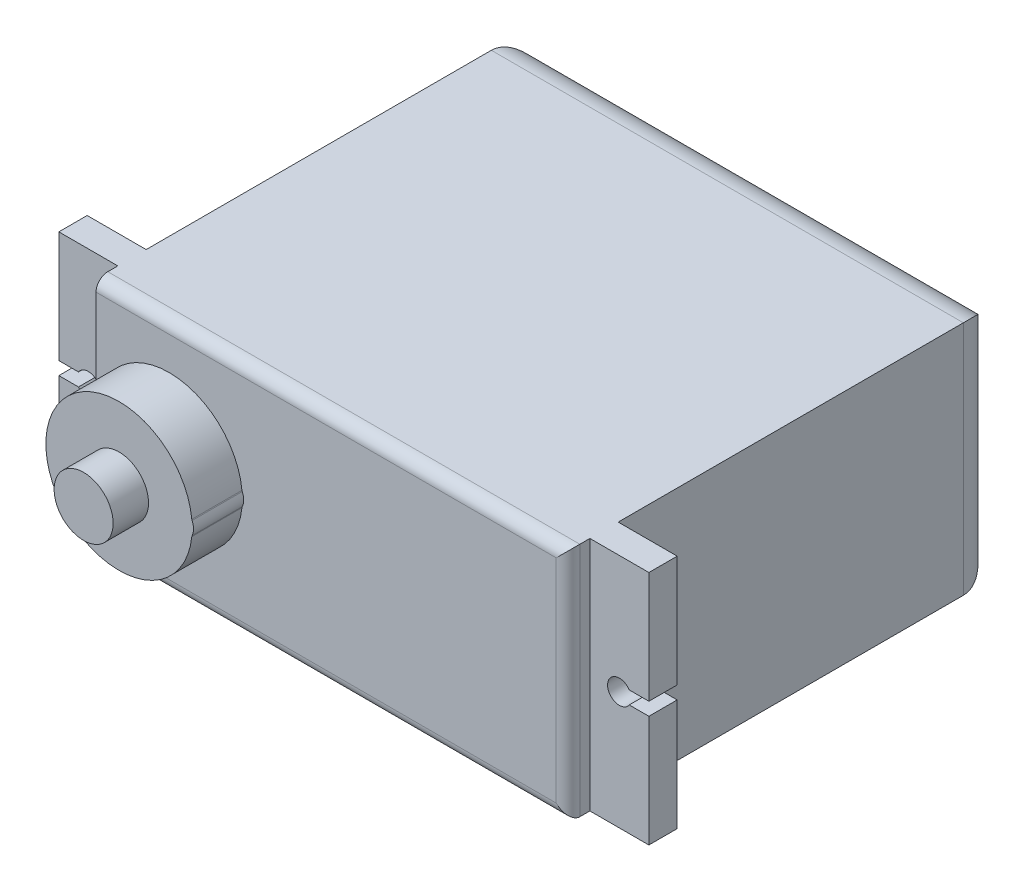
ISO-10303-21;
HEADER;
FILE_DESCRIPTION(('STEP AP214'),'2;1');
FILE_NAME('part.step','',(''),(''),'','','');
FILE_SCHEMA(('AUTOMOTIVE_DESIGN { 1 0 10303 214 1 1 1 1 }'));
ENDSEC;
DATA;
#1=APPLICATION_CONTEXT('core data for automotive mechanical design processes');
#2=APPLICATION_PROTOCOL_DEFINITION('international standard','automotive_design',2000,#1);
#3=PRODUCT_CONTEXT('',#1,'mechanical');
#4=PRODUCT('Part','Part','',(#3));
#5=PRODUCT_RELATED_PRODUCT_CATEGORY('part','',(#4));
#6=PRODUCT_DEFINITION_FORMATION('','',#4);
#7=PRODUCT_DEFINITION_CONTEXT('part definition',#1,'design');
#8=PRODUCT_DEFINITION('design','',#6,#7);
#9=PRODUCT_DEFINITION_SHAPE('','',#8);
#10=(LENGTH_UNIT() NAMED_UNIT(*) SI_UNIT(.MILLI.,.METRE.));
#11=(NAMED_UNIT(*) PLANE_ANGLE_UNIT() SI_UNIT($,.RADIAN.));
#12=(NAMED_UNIT(*) SI_UNIT($,.STERADIAN.) SOLID_ANGLE_UNIT());
#13=UNCERTAINTY_MEASURE_WITH_UNIT(LENGTH_MEASURE(1.E-05),#10,'distance_accuracy_value','');
#14=(GEOMETRIC_REPRESENTATION_CONTEXT(3) GLOBAL_UNCERTAINTY_ASSIGNED_CONTEXT((#13)) GLOBAL_UNIT_ASSIGNED_CONTEXT((#10,
#11,#12)) REPRESENTATION_CONTEXT('',''));
#15=CARTESIAN_POINT('',(0.,0.,0.));
#16=DIRECTION('',(0.,0.,1.));
#17=DIRECTION('',(1.,0.,0.));
#18=AXIS2_PLACEMENT_3D('',#15,#16,#17);
#19=CARTESIAN_POINT('',(25.,15.5461698495448,32.25));
#20=DIRECTION('',(1.,0.,0.));
#21=DIRECTION('',(0.,0.,-1.));
#22=AXIS2_PLACEMENT_3D('',#19,#20,#21);
#23=PLANE('',#22);
#24=DIRECTION('',(0.,0.,1.));
#25=VECTOR('',#24,1.);
#26=CARTESIAN_POINT('',(25.,-0.549999999999994,0.));
#27=LINE('',#26,#25);
#28=CARTESIAN_POINT('',(25.,-0.549999999999994,32.25));
#29=VERTEX_POINT('',#28);
#30=CARTESIAN_POINT('',(25.,-0.549999999999994,34.65));
#31=VERTEX_POINT('',#30);
#32=EDGE_CURVE('E267',#29,#31,#27,.T.);
#33=ORIENTED_EDGE('',*,*,#32,.T.);
#34=DIRECTION('',(0.,-1.,0.));
#35=VECTOR('',#34,1.);
#36=CARTESIAN_POINT('',(25.,15.5461698495448,34.65));
#37=LINE('',#36,#35);
#38=CARTESIAN_POINT('',(25.,-10.,34.65));
#39=VERTEX_POINT('',#38);
#40=EDGE_CURVE('E344',#31,#39,#37,.T.);
#41=ORIENTED_EDGE('',*,*,#40,.T.);
#42=DIRECTION('',(0.,0.,1.));
#43=VECTOR('',#42,1.);
#44=CARTESIAN_POINT('',(25.,-10.,32.25));
#45=LINE('',#44,#43);
#46=CARTESIAN_POINT('',(25.,-10.,32.25));
#47=VERTEX_POINT('',#46);
#48=EDGE_CURVE('E332',#47,#39,#45,.T.);
#49=ORIENTED_EDGE('',*,*,#48,.F.);
#50=DIRECTION('',(0.,-1.,0.));
#51=VECTOR('',#50,1.);
#52=CARTESIAN_POINT('',(25.,15.5461698495448,32.25));
#53=LINE('',#52,#51);
#54=EDGE_CURVE('E348',#29,#47,#53,.T.);
#55=ORIENTED_EDGE('',*,*,#54,.F.);
#56=EDGE_LOOP('',(#33,#41,#49,#55));
#57=FACE_BOUND('',#56,.T.);
#58=ADVANCED_FACE('F34',(#57),#23,.T.);
#59=CARTESIAN_POINT('',(-25.,15.5461698495448,32.25));
#60=DIRECTION('',(-1.,0.,0.));
#61=DIRECTION('',(0.,0.,1.));
#62=AXIS2_PLACEMENT_3D('',#59,#60,#61);
#63=PLANE('',#62);
#64=DIRECTION('',(0.,0.,1.));
#65=VECTOR('',#64,1.);
#66=CARTESIAN_POINT('',(-25.,0.55,0.));
#67=LINE('',#66,#65);
#68=CARTESIAN_POINT('',(-25.,0.55,32.25));
#69=VERTEX_POINT('',#68);
#70=CARTESIAN_POINT('',(-25.,0.55,34.65));
#71=VERTEX_POINT('',#70);
#72=EDGE_CURVE('E261',#69,#71,#67,.T.);
#73=ORIENTED_EDGE('',*,*,#72,.T.);
#74=DIRECTION('',(0.,-1.,0.));
#75=VECTOR('',#74,1.);
#76=CARTESIAN_POINT('',(-25.,15.5461698495448,34.65));
#77=LINE('',#76,#75);
#78=CARTESIAN_POINT('',(-25.,10.,34.65));
#79=VERTEX_POINT('',#78);
#80=EDGE_CURVE('E315',#79,#71,#77,.T.);
#81=ORIENTED_EDGE('',*,*,#80,.F.);
#82=DIRECTION('',(0.,0.,1.));
#83=VECTOR('',#82,1.);
#84=CARTESIAN_POINT('',(-25.,10.,32.25));
#85=LINE('',#84,#83);
#86=CARTESIAN_POINT('',(-25.,10.,32.25));
#87=VERTEX_POINT('',#86);
#88=EDGE_CURVE('E294',#87,#79,#85,.T.);
#89=ORIENTED_EDGE('',*,*,#88,.F.);
#90=DIRECTION('',(0.,-1.,0.));
#91=VECTOR('',#90,1.);
#92=CARTESIAN_POINT('',(-25.,15.5461698495448,32.25));
#93=LINE('',#92,#91);
#94=EDGE_CURVE('E311',#87,#69,#93,.T.);
#95=ORIENTED_EDGE('',*,*,#94,.T.);
#96=EDGE_LOOP('',(#73,#81,#89,#95));
#97=FACE_BOUND('',#96,.T.);
#98=ADVANCED_FACE('F471',(#97),#63,.T.);
#99=CARTESIAN_POINT('',(-20.,-10.,36.5));
#100=DIRECTION('',(1.,0.,0.));
#101=DIRECTION('',(0.,0.,-1.));
#102=AXIS2_PLACEMENT_3D('',#99,#100,#101);
#103=PLANE('',#102);
#104=DIRECTION('',(0.,0.,-1.));
#105=VECTOR('',#104,1.);
#106=CARTESIAN_POINT('',(-20.,10.,36.5));
#107=LINE('',#106,#105);
#108=CARTESIAN_POINT('',(-20.,10.,32.25));
#109=VERTEX_POINT('',#108);
#110=CARTESIAN_POINT('',(-20.,10.,3.));
#111=VERTEX_POINT('',#110);
#112=EDGE_CURVE('E361',#109,#111,#107,.T.);
#113=ORIENTED_EDGE('',*,*,#112,.T.);
#114=DIRECTION('',(0.,-1.,0.));
#115=VECTOR('',#114,1.);
#116=CARTESIAN_POINT('',(-20.,-10.,3.));
#117=LINE('',#116,#115);
#118=CARTESIAN_POINT('',(-20.,-10.,3.));
#119=VERTEX_POINT('',#118);
#120=EDGE_CURVE('E390',#111,#119,#117,.T.);
#121=ORIENTED_EDGE('',*,*,#120,.T.);
#122=DIRECTION('',(0.,0.,-1.));
#123=VECTOR('',#122,1.);
#124=CARTESIAN_POINT('',(-20.,-10.,36.5));
#125=LINE('',#124,#123);
#126=CARTESIAN_POINT('',(-20.,-10.,32.25));
#127=VERTEX_POINT('',#126);
#128=EDGE_CURVE('E358',#127,#119,#125,.T.);
#129=ORIENTED_EDGE('',*,*,#128,.F.);
#130=DIRECTION('',(0.,-1.,0.));
#131=VECTOR('',#130,1.);
#132=CARTESIAN_POINT('',(-20.,15.5461698495448,32.25));
#133=LINE('',#132,#131);
#134=EDGE_CURVE('E297',#109,#127,#133,.T.);
#135=ORIENTED_EDGE('',*,*,#134,.F.);
#136=EDGE_LOOP('',(#113,#121,#129,#135));
#137=FACE_BOUND('',#136,.T.);
#138=ADVANCED_FACE('F478',(#137),#103,.F.);
#139=CARTESIAN_POINT('',(20.,-10.,36.5));
#140=DIRECTION('',(-1.,0.,0.));
#141=DIRECTION('',(0.,0.,1.));
#142=AXIS2_PLACEMENT_3D('',#139,#140,#141);
#143=PLANE('',#142);
#144=DIRECTION('',(0.,0.,-1.));
#145=VECTOR('',#144,1.);
#146=CARTESIAN_POINT('',(20.,10.,36.5));
#147=LINE('',#146,#145);
#148=CARTESIAN_POINT('',(20.,10.,35.5));
#149=VERTEX_POINT('',#148);
#150=CARTESIAN_POINT('',(20.,10.,34.65));
#151=VERTEX_POINT('',#150);
#152=EDGE_CURVE('E365',#149,#151,#147,.T.);
#153=ORIENTED_EDGE('',*,*,#152,.F.);
#154=DIRECTION('',(0.,1.,0.));
#155=VECTOR('',#154,1.);
#156=CARTESIAN_POINT('',(20.,-10.,35.5));
#157=LINE('',#156,#155);
#158=CARTESIAN_POINT('',(20.,-10.,35.5));
#159=VERTEX_POINT('',#158);
#160=EDGE_CURVE('E43',#149,#159,#157,.F.);
#161=ORIENTED_EDGE('',*,*,#160,.T.);
#162=DIRECTION('',(0.,0.,-1.));
#163=VECTOR('',#162,1.);
#164=CARTESIAN_POINT('',(20.,-10.,36.5));
#165=LINE('',#164,#163);
#166=CARTESIAN_POINT('',(20.,-10.,34.65));
#167=VERTEX_POINT('',#166);
#168=EDGE_CURVE('E356',#159,#167,#165,.T.);
#169=ORIENTED_EDGE('',*,*,#168,.T.);
#170=DIRECTION('',(0.,-1.,0.));
#171=VECTOR('',#170,1.);
#172=CARTESIAN_POINT('',(20.,15.5461698495448,34.65));
#173=LINE('',#172,#171);
#174=EDGE_CURVE('E327',#151,#167,#173,.T.);
#175=ORIENTED_EDGE('',*,*,#174,.F.);
#176=EDGE_LOOP('',(#153,#161,#169,#175));
#177=FACE_BOUND('',#176,.T.);
#178=ADVANCED_FACE('F570',(#177),#143,.F.);
#179=CARTESIAN_POINT('',(20.,-10.,32.25));
#180=VERTEX_POINT('',#179);
#181=CARTESIAN_POINT('',(20.,-10.,3.));
#182=VERTEX_POINT('',#181);
#183=EDGE_CURVE('E355',#180,#182,#165,.T.);
#184=ORIENTED_EDGE('',*,*,#183,.T.);
#185=DIRECTION('',(0.,1.,0.));
#186=VECTOR('',#185,1.);
#187=CARTESIAN_POINT('',(20.,10.,3.));
#188=LINE('',#187,#186);
#189=CARTESIAN_POINT('',(20.,10.,3.));
#190=VERTEX_POINT('',#189);
#191=EDGE_CURVE('E375',#182,#190,#188,.T.);
#192=ORIENTED_EDGE('',*,*,#191,.T.);
#193=CARTESIAN_POINT('',(20.,10.,32.25));
#194=VERTEX_POINT('',#193);
#195=EDGE_CURVE('E364',#194,#190,#147,.T.);
#196=ORIENTED_EDGE('',*,*,#195,.F.);
#197=DIRECTION('',(0.,-1.,0.));
#198=VECTOR('',#197,1.);
#199=CARTESIAN_POINT('',(20.,15.5461698495448,32.25));
#200=LINE('',#199,#198);
#201=EDGE_CURVE('E338',#194,#180,#200,.T.);
#202=ORIENTED_EDGE('',*,*,#201,.T.);
#203=EDGE_LOOP('',(#184,#192,#196,#202));
#204=FACE_BOUND('',#203,.T.);
#205=ADVANCED_FACE('F531',(#204),#143,.F.);
#206=CARTESIAN_POINT('',(-20.,10.,36.5));
#207=DIRECTION('',(0.,-1.,0.));
#208=DIRECTION('',(0.,0.,-1.));
#209=AXIS2_PLACEMENT_3D('',#206,#207,#208);
#210=PLANE('',#209);
#211=CARTESIAN_POINT('',(-20.,10.,35.5));
#212=VERTEX_POINT('',#211);
#213=CARTESIAN_POINT('',(-20.,10.,34.65));
#214=VERTEX_POINT('',#213);
#215=EDGE_CURVE('E362',#212,#214,#107,.T.);
#216=ORIENTED_EDGE('',*,*,#215,.F.);
#217=DIRECTION('',(-1.,0.,0.));
#218=VECTOR('',#217,1.);
#219=CARTESIAN_POINT('',(-20.,10.,35.5));
#220=LINE('',#219,#218);
#221=EDGE_CURVE('E11',#212,#149,#220,.F.);
#222=ORIENTED_EDGE('',*,*,#221,.T.);
#223=ORIENTED_EDGE('',*,*,#152,.T.);
#224=DIRECTION('',(1.,0.,0.));
#225=VECTOR('',#224,1.);
#226=CARTESIAN_POINT('',(20.,10.,34.65));
#227=LINE('',#226,#225);
#228=CARTESIAN_POINT('',(25.,10.,34.65));
#229=VERTEX_POINT('',#228);
#230=EDGE_CURVE('E326',#151,#229,#227,.T.);
#231=ORIENTED_EDGE('',*,*,#230,.T.);
#232=DIRECTION('',(0.,0.,-1.));
#233=VECTOR('',#232,1.);
#234=CARTESIAN_POINT('',(25.,10.,32.25));
#235=LINE('',#234,#233);
#236=CARTESIAN_POINT('',(25.,10.,32.25));
#237=VERTEX_POINT('',#236);
#238=EDGE_CURVE('E324',#229,#237,#235,.T.);
#239=ORIENTED_EDGE('',*,*,#238,.T.);
#240=DIRECTION('',(-1.,0.,0.));
#241=VECTOR('',#240,1.);
#242=CARTESIAN_POINT('',(20.,10.,32.25));
#243=LINE('',#242,#241);
#244=EDGE_CURVE('E329',#237,#194,#243,.T.);
#245=ORIENTED_EDGE('',*,*,#244,.T.);
#246=ORIENTED_EDGE('',*,*,#195,.T.);
#247=DIRECTION('',(-1.,0.,0.));
#248=VECTOR('',#247,1.);
#249=CARTESIAN_POINT('',(-20.,10.,3.));
#250=LINE('',#249,#248);
#251=EDGE_CURVE('E388',#190,#111,#250,.T.);
#252=ORIENTED_EDGE('',*,*,#251,.T.);
#253=ORIENTED_EDGE('',*,*,#112,.F.);
#254=DIRECTION('',(-1.,0.,0.));
#255=VECTOR('',#254,1.);
#256=CARTESIAN_POINT('',(-20.,10.,32.25));
#257=LINE('',#256,#255);
#258=EDGE_CURVE('E296',#109,#87,#257,.T.);
#259=ORIENTED_EDGE('',*,*,#258,.T.);
#260=ORIENTED_EDGE('',*,*,#88,.T.);
#261=DIRECTION('',(1.,0.,0.));
#262=VECTOR('',#261,1.);
#263=CARTESIAN_POINT('',(-20.,10.,34.65));
#264=LINE('',#263,#262);
#265=EDGE_CURVE('E299',#79,#214,#264,.T.);
#266=ORIENTED_EDGE('',*,*,#265,.T.);
#267=EDGE_LOOP('',(#216,#222,#223,#231,#239,#245,#246,#252,#253,#259,#260,#266));
#268=FACE_BOUND('',#267,.T.);
#269=ADVANCED_FACE('F509',(#268),#210,.F.);
#270=CARTESIAN_POINT('',(-20.,-10.,35.5));
#271=VERTEX_POINT('',#270);
#272=CARTESIAN_POINT('',(-20.,-10.,34.65));
#273=VERTEX_POINT('',#272);
#274=EDGE_CURVE('E359',#271,#273,#125,.T.);
#275=ORIENTED_EDGE('',*,*,#274,.F.);
#276=CARTESIAN_POINT('',(-20.,-9.,35.5));
#277=DIRECTION('',(1.,0.,0.));
#278=DIRECTION('',(0.,0.,-1.));
#279=AXIS2_PLACEMENT_3D('',#276,#277,#278);
#280=CIRCLE('',#279,1.);
#281=CARTESIAN_POINT('',(-20.,-9.,36.5));
#282=VERTEX_POINT('',#281);
#283=EDGE_CURVE('E415',#271,#282,#280,.F.);
#284=ORIENTED_EDGE('',*,*,#283,.T.);
#285=DIRECTION('',(0.,-1.,0.));
#286=VECTOR('',#285,1.);
#287=CARTESIAN_POINT('',(-20.,-10.,36.5));
#288=LINE('',#287,#286);
#289=CARTESIAN_POINT('',(-20.,0.,36.5));
#290=VERTEX_POINT('',#289);
#291=EDGE_CURVE('E352',#290,#282,#288,.T.);
#292=ORIENTED_EDGE('',*,*,#291,.F.);
#293=CARTESIAN_POINT('',(-20.,9.,36.5));
#294=VERTEX_POINT('',#293);
#295=EDGE_CURVE('E353',#294,#290,#288,.T.);
#296=ORIENTED_EDGE('',*,*,#295,.F.);
#297=CARTESIAN_POINT('',(-20.,9.,35.5));
#298=DIRECTION('',(1.,0.,0.));
#299=DIRECTION('',(0.,0.,-1.));
#300=AXIS2_PLACEMENT_3D('',#297,#298,#299);
#301=CIRCLE('',#300,1.);
#302=EDGE_CURVE('E57',#294,#212,#301,.F.);
#303=ORIENTED_EDGE('',*,*,#302,.T.);
#304=ORIENTED_EDGE('',*,*,#215,.T.);
#305=DIRECTION('',(0.,-1.,0.));
#306=VECTOR('',#305,1.);
#307=CARTESIAN_POINT('',(-20.,15.5461698495448,34.65));
#308=LINE('',#307,#306);
#309=EDGE_CURVE('E308',#214,#273,#308,.T.);
#310=ORIENTED_EDGE('',*,*,#309,.T.);
#311=EDGE_LOOP('',(#275,#284,#292,#296,#303,#304,#310));
#312=FACE_BOUND('',#311,.T.);
#313=ADVANCED_FACE('F436',(#312),#103,.F.);
#314=CARTESIAN_POINT('',(-20.,-10.,36.5));
#315=DIRECTION('',(0.,1.,0.));
#316=DIRECTION('',(0.,0.,1.));
#317=AXIS2_PLACEMENT_3D('',#314,#315,#316);
#318=PLANE('',#317);
#319=ORIENTED_EDGE('',*,*,#168,.F.);
#320=DIRECTION('',(1.,0.,0.));
#321=VECTOR('',#320,1.);
#322=CARTESIAN_POINT('',(-20.,-10.,35.5));
#323=LINE('',#322,#321);
#324=EDGE_CURVE('E412',#159,#271,#323,.F.);
#325=ORIENTED_EDGE('',*,*,#324,.T.);
#326=ORIENTED_EDGE('',*,*,#274,.T.);
#327=DIRECTION('',(-1.,0.,0.));
#328=VECTOR('',#327,1.);
#329=CARTESIAN_POINT('',(-20.,-10.,34.65));
#330=LINE('',#329,#328);
#331=CARTESIAN_POINT('',(-25.,-10.,34.65));
#332=VERTEX_POINT('',#331);
#333=EDGE_CURVE('E293',#273,#332,#330,.T.);
#334=ORIENTED_EDGE('',*,*,#333,.T.);
#335=DIRECTION('',(0.,0.,-1.));
#336=VECTOR('',#335,1.);
#337=CARTESIAN_POINT('',(-25.,-10.,32.25));
#338=LINE('',#337,#336);
#339=CARTESIAN_POINT('',(-25.,-10.,32.25));
#340=VERTEX_POINT('',#339);
#341=EDGE_CURVE('E302',#332,#340,#338,.T.);
#342=ORIENTED_EDGE('',*,*,#341,.T.);
#343=DIRECTION('',(1.,0.,0.));
#344=VECTOR('',#343,1.);
#345=CARTESIAN_POINT('',(-20.,-10.,32.25));
#346=LINE('',#345,#344);
#347=EDGE_CURVE('E305',#340,#127,#346,.T.);
#348=ORIENTED_EDGE('',*,*,#347,.T.);
#349=ORIENTED_EDGE('',*,*,#128,.T.);
#350=DIRECTION('',(1.,0.,0.));
#351=VECTOR('',#350,1.);
#352=CARTESIAN_POINT('',(20.,-10.,3.));
#353=LINE('',#352,#351);
#354=EDGE_CURVE('E392',#119,#182,#353,.T.);
#355=ORIENTED_EDGE('',*,*,#354,.T.);
#356=ORIENTED_EDGE('',*,*,#183,.F.);
#357=DIRECTION('',(1.,0.,0.));
#358=VECTOR('',#357,1.);
#359=CARTESIAN_POINT('',(20.,-10.,32.25));
#360=LINE('',#359,#358);
#361=EDGE_CURVE('E323',#180,#47,#360,.T.);
#362=ORIENTED_EDGE('',*,*,#361,.T.);
#363=ORIENTED_EDGE('',*,*,#48,.T.);
#364=DIRECTION('',(-1.,0.,0.));
#365=VECTOR('',#364,1.);
#366=CARTESIAN_POINT('',(20.,-10.,34.65));
#367=LINE('',#366,#365);
#368=EDGE_CURVE('E335',#39,#167,#367,.T.);
#369=ORIENTED_EDGE('',*,*,#368,.T.);
#370=EDGE_LOOP('',(#319,#325,#326,#334,#342,#348,#349,#355,#356,#362,#363,#369));
#371=FACE_BOUND('',#370,.T.);
#372=ADVANCED_FACE('F525',(#371),#318,.F.);
#373=CARTESIAN_POINT('',(0.,0.,36.5));
#374=DIRECTION('',(0.,0.,-1.));
#375=DIRECTION('',(-1.,0.,0.));
#376=AXIS2_PLACEMENT_3D('',#373,#374,#375);
#377=PLANE('',#376);
#378=ORIENTED_EDGE('',*,*,#291,.T.);
#379=DIRECTION('',(1.,0.,0.));
#380=VECTOR('',#379,1.);
#381=CARTESIAN_POINT('',(0.,-9.,36.5));
#382=LINE('',#381,#380);
#383=CARTESIAN_POINT('',(19.,-9.,36.5));
#384=VERTEX_POINT('',#383);
#385=EDGE_CURVE('E409',#282,#384,#382,.T.);
#386=ORIENTED_EDGE('',*,*,#385,.T.);
#387=DIRECTION('',(0.,1.,0.));
#388=VECTOR('',#387,1.);
#389=CARTESIAN_POINT('',(19.,0.,36.5));
#390=LINE('',#389,#388);
#391=CARTESIAN_POINT('',(19.,9.,36.5));
#392=VERTEX_POINT('',#391);
#393=EDGE_CURVE('E407',#384,#392,#390,.T.);
#394=ORIENTED_EDGE('',*,*,#393,.T.);
#395=DIRECTION('',(-1.,0.,0.));
#396=VECTOR('',#395,1.);
#397=CARTESIAN_POINT('',(0.,9.,36.5));
#398=LINE('',#397,#396);
#399=EDGE_CURVE('E394',#392,#294,#398,.T.);
#400=ORIENTED_EDGE('',*,*,#399,.T.);
#401=ORIENTED_EDGE('',*,*,#295,.T.);
#402=CARTESIAN_POINT('',(-13.8,0.,36.5));
#403=DIRECTION('',(0.,0.,1.));
#404=DIRECTION('',(1.,0.,0.));
#405=AXIS2_PLACEMENT_3D('',#402,#403,#404);
#406=CIRCLE('',#405,6.2);
#407=CARTESIAN_POINT('',(-7.63295595507192,0.638410328798895,36.5));
#408=VERTEX_POINT('',#407);
#409=EDGE_CURVE('E244',#408,#290,#406,.T.);
#410=ORIENTED_EDGE('',*,*,#409,.F.);
#411=CARTESIAN_POINT('',(-7.38428482422805,0.664152680766592,36.5));
#412=DIRECTION('',(0.,0.,-1.));
#413=DIRECTION('',(-1.,0.,0.));
#414=AXIS2_PLACEMENT_3D('',#411,#412,#413);
#415=CIRCLE('',#414,0.25);
#416=CARTESIAN_POINT('',(-7.61017197666384,0.557031280642949,36.5));
#417=VERTEX_POINT('',#416);
#418=EDGE_CURVE('E445',#417,#408,#415,.T.);
#419=ORIENTED_EDGE('',*,*,#418,.F.);
#420=CARTESIAN_POINT('',(-8.78478516932995,0.,36.5));
#421=DIRECTION('',(0.,0.,1.));
#422=DIRECTION('',(1.,0.,0.));
#423=AXIS2_PLACEMENT_3D('',#420,#421,#422);
#424=CIRCLE('',#423,1.3);
#425=CARTESIAN_POINT('',(-7.61017197666384,-0.557031280642949,36.5));
#426=VERTEX_POINT('',#425);
#427=EDGE_CURVE('E447',#426,#417,#424,.T.);
#428=ORIENTED_EDGE('',*,*,#427,.F.);
#429=CARTESIAN_POINT('',(-7.38428482422805,-0.664152680766593,36.5));
#430=DIRECTION('',(0.,0.,-1.));
#431=DIRECTION('',(1.,0.,0.));
#432=AXIS2_PLACEMENT_3D('',#429,#430,#431);
#433=CIRCLE('',#432,0.25);
#434=CARTESIAN_POINT('',(-7.63295595507192,-0.638410328798899,36.5));
#435=VERTEX_POINT('',#434);
#436=EDGE_CURVE('E247',#435,#426,#433,.T.);
#437=ORIENTED_EDGE('',*,*,#436,.F.);
#438=EDGE_CURVE('E374',#290,#435,#406,.T.);
#439=ORIENTED_EDGE('',*,*,#438,.F.);
#440=EDGE_LOOP('',(#378,#386,#394,#400,#401,#410,#419,#428,#437,#439));
#441=FACE_BOUND('',#440,.T.);
#442=ADVANCED_FACE('F432',(#441),#377,.F.);
#443=CARTESIAN_POINT('',(0.,0.,0.));
#444=DIRECTION('',(0.,0.,-1.));
#445=DIRECTION('',(-1.,0.,0.));
#446=AXIS2_PLACEMENT_3D('',#443,#444,#445);
#447=PLANE('',#446);
#448=DIRECTION('',(-1.,0.,0.));
#449=VECTOR('',#448,1.);
#450=CARTESIAN_POINT('',(20.,7.,0.));
#451=LINE('',#450,#449);
#452=CARTESIAN_POINT('',(-17.,7.,0.));
#453=VERTEX_POINT('',#452);
#454=CARTESIAN_POINT('',(17.,7.,0.));
#455=VERTEX_POINT('',#454);
#456=EDGE_CURVE('E383',#453,#455,#451,.F.);
#457=ORIENTED_EDGE('',*,*,#456,.T.);
#458=DIRECTION('',(0.,1.,0.));
#459=VECTOR('',#458,1.);
#460=CARTESIAN_POINT('',(17.,-10.,0.));
#461=LINE('',#460,#459);
#462=CARTESIAN_POINT('',(17.,-7.,0.));
#463=VERTEX_POINT('',#462);
#464=EDGE_CURVE('E385',#455,#463,#461,.F.);
#465=ORIENTED_EDGE('',*,*,#464,.T.);
#466=DIRECTION('',(1.,0.,0.));
#467=VECTOR('',#466,1.);
#468=CARTESIAN_POINT('',(-20.,-7.,0.));
#469=LINE('',#468,#467);
#470=CARTESIAN_POINT('',(-17.,-7.,0.));
#471=VERTEX_POINT('',#470);
#472=EDGE_CURVE('E378',#463,#471,#469,.F.);
#473=ORIENTED_EDGE('',*,*,#472,.T.);
#474=DIRECTION('',(0.,-1.,0.));
#475=VECTOR('',#474,1.);
#476=CARTESIAN_POINT('',(-17.,10.,0.));
#477=LINE('',#476,#475);
#478=EDGE_CURVE('E381',#471,#453,#477,.F.);
#479=ORIENTED_EDGE('',*,*,#478,.T.);
#480=EDGE_LOOP('',(#457,#465,#473,#479));
#481=FACE_BOUND('',#480,.T.);
#482=ADVANCED_FACE('F494',(#481),#447,.T.);
#483=CARTESIAN_POINT('',(20.,15.5461698495448,34.65));
#484=DIRECTION('',(0.,0.,1.));
#485=DIRECTION('',(1.,0.,0.));
#486=AXIS2_PLACEMENT_3D('',#483,#484,#485);
#487=PLANE('',#486);
#488=DIRECTION('',(1.,0.,0.));
#489=VECTOR('',#488,1.);
#490=CARTESIAN_POINT('',(25.,-0.549999999999994,34.65));
#491=LINE('',#490,#489);
#492=CARTESIAN_POINT('',(23.3351646544245,-0.550000000000006,34.65));
#493=VERTEX_POINT('',#492);
#494=EDGE_CURVE('E264',#493,#31,#491,.T.);
#495=ORIENTED_EDGE('',*,*,#494,.F.);
#496=CARTESIAN_POINT('',(22.5,0.,34.65));
#497=DIRECTION('',(0.,0.,1.));
#498=DIRECTION('',(-1.,0.,0.));
#499=AXIS2_PLACEMENT_3D('',#496,#497,#498);
#500=CIRCLE('',#499,1.);
#501=CARTESIAN_POINT('',(23.3351646544245,0.550000000000008,34.65));
#502=VERTEX_POINT('',#501);
#503=EDGE_CURVE('E260',#502,#493,#500,.T.);
#504=ORIENTED_EDGE('',*,*,#503,.F.);
#505=DIRECTION('',(-1.,0.,0.));
#506=VECTOR('',#505,1.);
#507=CARTESIAN_POINT('',(25.,0.549999999999994,34.65));
#508=LINE('',#507,#506);
#509=CARTESIAN_POINT('',(25.,0.549999999999994,34.65));
#510=VERTEX_POINT('',#509);
#511=EDGE_CURVE('E257',#510,#502,#508,.T.);
#512=ORIENTED_EDGE('',*,*,#511,.F.);
#513=EDGE_CURVE('E341',#229,#510,#37,.T.);
#514=ORIENTED_EDGE('',*,*,#513,.F.);
#515=ORIENTED_EDGE('',*,*,#230,.F.);
#516=ORIENTED_EDGE('',*,*,#174,.T.);
#517=ORIENTED_EDGE('',*,*,#368,.F.);
#518=ORIENTED_EDGE('',*,*,#40,.F.);
#519=EDGE_LOOP('',(#495,#504,#512,#514,#515,#516,#517,#518));
#520=FACE_BOUND('',#519,.T.);
#521=ADVANCED_FACE('F486',(#520),#487,.T.);
#522=DIRECTION('',(0.,0.,1.));
#523=VECTOR('',#522,1.);
#524=CARTESIAN_POINT('',(25.,0.549999999999994,0.));
#525=LINE('',#524,#523);
#526=CARTESIAN_POINT('',(25.,0.549999999999994,32.25));
#527=VERTEX_POINT('',#526);
#528=EDGE_CURVE('E266',#527,#510,#525,.T.);
#529=ORIENTED_EDGE('',*,*,#528,.F.);
#530=EDGE_CURVE('E345',#237,#527,#53,.T.);
#531=ORIENTED_EDGE('',*,*,#530,.F.);
#532=ORIENTED_EDGE('',*,*,#238,.F.);
#533=ORIENTED_EDGE('',*,*,#513,.T.);
#534=EDGE_LOOP('',(#529,#531,#532,#533));
#535=FACE_BOUND('',#534,.T.);
#536=ADVANCED_FACE('F474',(#535),#23,.T.);
#537=CARTESIAN_POINT('',(20.,15.5461698495448,32.25));
#538=DIRECTION('',(0.,0.,-1.));
#539=DIRECTION('',(-1.,0.,0.));
#540=AXIS2_PLACEMENT_3D('',#537,#538,#539);
#541=PLANE('',#540);
#542=DIRECTION('',(-1.,0.,0.));
#543=VECTOR('',#542,1.);
#544=CARTESIAN_POINT('',(20.0000000000001,-0.550000000000028,32.25));
#545=LINE('',#544,#543);
#546=CARTESIAN_POINT('',(23.3351646544245,-0.550000000000006,32.25));
#547=VERTEX_POINT('',#546);
#548=EDGE_CURVE('E372',#29,#547,#545,.T.);
#549=ORIENTED_EDGE('',*,*,#548,.F.);
#550=ORIENTED_EDGE('',*,*,#54,.T.);
#551=ORIENTED_EDGE('',*,*,#361,.F.);
#552=ORIENTED_EDGE('',*,*,#201,.F.);
#553=ORIENTED_EDGE('',*,*,#244,.F.);
#554=ORIENTED_EDGE('',*,*,#530,.T.);
#555=DIRECTION('',(1.,0.,0.));
#556=VECTOR('',#555,1.);
#557=CARTESIAN_POINT('',(19.9999999999999,0.550000000000028,32.25));
#558=LINE('',#557,#556);
#559=CARTESIAN_POINT('',(23.3351646544245,0.550000000000004,32.25));
#560=VERTEX_POINT('',#559);
#561=EDGE_CURVE('E367',#560,#527,#558,.T.);
#562=ORIENTED_EDGE('',*,*,#561,.F.);
#563=CARTESIAN_POINT('',(22.5,0.,32.25));
#564=DIRECTION('',(0.,0.,-1.));
#565=DIRECTION('',(-1.,0.,0.));
#566=AXIS2_PLACEMENT_3D('',#563,#564,#565);
#567=CIRCLE('',#566,1.);
#568=EDGE_CURVE('E369',#547,#560,#567,.T.);
#569=ORIENTED_EDGE('',*,*,#568,.F.);
#570=EDGE_LOOP('',(#549,#550,#551,#552,#553,#554,#562,#569));
#571=FACE_BOUND('',#570,.T.);
#572=ADVANCED_FACE('F485',(#571),#541,.T.);
#573=CARTESIAN_POINT('',(-20.,15.5461698495448,32.25));
#574=DIRECTION('',(0.,0.,-1.));
#575=DIRECTION('',(-1.,0.,0.));
#576=AXIS2_PLACEMENT_3D('',#573,#574,#575);
#577=PLANE('',#576);
#578=DIRECTION('',(1.,0.,0.));
#579=VECTOR('',#578,1.);
#580=CARTESIAN_POINT('',(-20.,0.55,32.25));
#581=LINE('',#580,#579);
#582=CARTESIAN_POINT('',(-23.3351646544245,0.55,32.25));
#583=VERTEX_POINT('',#582);
#584=EDGE_CURVE('E291',#69,#583,#581,.T.);
#585=ORIENTED_EDGE('',*,*,#584,.F.);
#586=ORIENTED_EDGE('',*,*,#94,.F.);
#587=ORIENTED_EDGE('',*,*,#258,.F.);
#588=ORIENTED_EDGE('',*,*,#134,.T.);
#589=ORIENTED_EDGE('',*,*,#347,.F.);
#590=CARTESIAN_POINT('',(-25.,-0.55,32.25));
#591=VERTEX_POINT('',#590);
#592=EDGE_CURVE('E314',#591,#340,#93,.T.);
#593=ORIENTED_EDGE('',*,*,#592,.F.);
#594=DIRECTION('',(-1.,0.,0.));
#595=VECTOR('',#594,1.);
#596=CARTESIAN_POINT('',(-20.,-0.55,32.25));
#597=LINE('',#596,#595);
#598=CARTESIAN_POINT('',(-23.3351646544245,-0.55,32.25));
#599=VERTEX_POINT('',#598);
#600=EDGE_CURVE('E270',#599,#591,#597,.T.);
#601=ORIENTED_EDGE('',*,*,#600,.F.);
#602=CARTESIAN_POINT('',(-22.5,0.,32.25));
#603=DIRECTION('',(0.,0.,-1.));
#604=DIRECTION('',(-1.,0.,0.));
#605=AXIS2_PLACEMENT_3D('',#602,#603,#604);
#606=CIRCLE('',#605,1.);
#607=EDGE_CURVE('E289',#583,#599,#606,.T.);
#608=ORIENTED_EDGE('',*,*,#607,.F.);
#609=EDGE_LOOP('',(#585,#586,#587,#588,#589,#593,#601,#608));
#610=FACE_BOUND('',#609,.T.);
#611=ADVANCED_FACE('F492',(#610),#577,.T.);
#612=DIRECTION('',(0.,0.,1.));
#613=VECTOR('',#612,1.);
#614=CARTESIAN_POINT('',(-25.,-0.55,0.));
#615=LINE('',#614,#613);
#616=CARTESIAN_POINT('',(-25.,-0.55,34.65));
#617=VERTEX_POINT('',#616);
#618=EDGE_CURVE('E280',#591,#617,#615,.T.);
#619=ORIENTED_EDGE('',*,*,#618,.F.);
#620=ORIENTED_EDGE('',*,*,#592,.T.);
#621=ORIENTED_EDGE('',*,*,#341,.F.);
#622=EDGE_CURVE('E318',#617,#332,#77,.T.);
#623=ORIENTED_EDGE('',*,*,#622,.F.);
#624=EDGE_LOOP('',(#619,#620,#621,#623));
#625=FACE_BOUND('',#624,.T.);
#626=ADVANCED_FACE('F481',(#625),#63,.T.);
#627=CARTESIAN_POINT('',(-20.,15.5461698495448,34.65));
#628=DIRECTION('',(0.,0.,1.));
#629=DIRECTION('',(1.,0.,0.));
#630=AXIS2_PLACEMENT_3D('',#627,#628,#629);
#631=PLANE('',#630);
#632=DIRECTION('',(-1.,0.,0.));
#633=VECTOR('',#632,1.);
#634=CARTESIAN_POINT('',(-25.,0.55,34.65));
#635=LINE('',#634,#633);
#636=CARTESIAN_POINT('',(-23.3351646544245,0.55,34.65));
#637=VERTEX_POINT('',#636);
#638=EDGE_CURVE('E278',#637,#71,#635,.T.);
#639=ORIENTED_EDGE('',*,*,#638,.F.);
#640=CARTESIAN_POINT('',(-22.5,0.,34.65));
#641=DIRECTION('',(0.,0.,1.));
#642=DIRECTION('',(1.,0.,0.));
#643=AXIS2_PLACEMENT_3D('',#640,#641,#642);
#644=CIRCLE('',#643,1.);
#645=CARTESIAN_POINT('',(-23.3351646544245,-0.55,34.65));
#646=VERTEX_POINT('',#645);
#647=EDGE_CURVE('E251',#646,#637,#644,.T.);
#648=ORIENTED_EDGE('',*,*,#647,.F.);
#649=DIRECTION('',(1.,0.,0.));
#650=VECTOR('',#649,1.);
#651=CARTESIAN_POINT('',(-25.,-0.55,34.65));
#652=LINE('',#651,#650);
#653=EDGE_CURVE('E248',#617,#646,#652,.T.);
#654=ORIENTED_EDGE('',*,*,#653,.F.);
#655=ORIENTED_EDGE('',*,*,#622,.T.);
#656=ORIENTED_EDGE('',*,*,#333,.F.);
#657=ORIENTED_EDGE('',*,*,#309,.F.);
#658=ORIENTED_EDGE('',*,*,#265,.F.);
#659=ORIENTED_EDGE('',*,*,#80,.T.);
#660=EDGE_LOOP('',(#639,#648,#654,#655,#656,#657,#658,#659));
#661=FACE_BOUND('',#660,.T.);
#662=ADVANCED_FACE('F706',(#661),#631,.T.);
#663=CARTESIAN_POINT('',(-25.,0.55,0.));
#664=DIRECTION('',(0.,1.,0.));
#665=DIRECTION('',(0.,0.,1.));
#666=AXIS2_PLACEMENT_3D('',#663,#664,#665);
#667=PLANE('',#666);
#668=ORIENTED_EDGE('',*,*,#584,.T.);
#669=DIRECTION('',(0.,0.,1.));
#670=VECTOR('',#669,1.);
#671=CARTESIAN_POINT('',(-23.3351646544245,0.55,0.));
#672=LINE('',#671,#670);
#673=EDGE_CURVE('E283',#583,#637,#672,.T.);
#674=ORIENTED_EDGE('',*,*,#673,.T.);
#675=ORIENTED_EDGE('',*,*,#638,.T.);
#676=ORIENTED_EDGE('',*,*,#72,.F.);
#677=EDGE_LOOP('',(#668,#674,#675,#676));
#678=FACE_BOUND('',#677,.T.);
#679=ADVANCED_FACE('F696',(#678),#667,.F.);
#680=CARTESIAN_POINT('',(-22.5,0.,0.));
#681=DIRECTION('',(0.,0.,1.));
#682=DIRECTION('',(1.,0.,0.));
#683=AXIS2_PLACEMENT_3D('',#680,#681,#682);
#684=CYLINDRICAL_SURFACE('',#683,1.);
#685=ORIENTED_EDGE('',*,*,#607,.T.);
#686=DIRECTION('',(0.,0.,1.));
#687=VECTOR('',#686,1.);
#688=CARTESIAN_POINT('',(-23.3351646544245,-0.55,0.));
#689=LINE('',#688,#687);
#690=EDGE_CURVE('E285',#599,#646,#689,.T.);
#691=ORIENTED_EDGE('',*,*,#690,.T.);
#692=ORIENTED_EDGE('',*,*,#647,.T.);
#693=ORIENTED_EDGE('',*,*,#673,.F.);
#694=EDGE_LOOP('',(#685,#691,#692,#693));
#695=FACE_BOUND('',#694,.T.);
#696=ADVANCED_FACE('F686',(#695),#684,.F.);
#697=CARTESIAN_POINT('',(-25.,-0.55,0.));
#698=DIRECTION('',(0.,-1.,0.));
#699=DIRECTION('',(0.,0.,-1.));
#700=AXIS2_PLACEMENT_3D('',#697,#698,#699);
#701=PLANE('',#700);
#702=ORIENTED_EDGE('',*,*,#600,.T.);
#703=ORIENTED_EDGE('',*,*,#618,.T.);
#704=ORIENTED_EDGE('',*,*,#653,.T.);
#705=ORIENTED_EDGE('',*,*,#690,.F.);
#706=EDGE_LOOP('',(#702,#703,#704,#705));
#707=FACE_BOUND('',#706,.T.);
#708=ADVANCED_FACE('F677',(#707),#701,.F.);
#709=CARTESIAN_POINT('',(25.,-0.549999999999994,0.));
#710=DIRECTION('',(0.,-1.,0.));
#711=DIRECTION('',(1.,0.,0.));
#712=AXIS2_PLACEMENT_3D('',#709,#710,#711);
#713=PLANE('',#712);
#714=ORIENTED_EDGE('',*,*,#548,.T.);
#715=DIRECTION('',(0.,0.,1.));
#716=VECTOR('',#715,1.);
#717=CARTESIAN_POINT('',(23.3351646544245,-0.550000000000006,0.));
#718=LINE('',#717,#716);
#719=EDGE_CURVE('E271',#547,#493,#718,.T.);
#720=ORIENTED_EDGE('',*,*,#719,.T.);
#721=ORIENTED_EDGE('',*,*,#494,.T.);
#722=ORIENTED_EDGE('',*,*,#32,.F.);
#723=EDGE_LOOP('',(#714,#720,#721,#722));
#724=FACE_BOUND('',#723,.T.);
#725=ADVANCED_FACE('F668',(#724),#713,.F.);
#726=CARTESIAN_POINT('',(22.5,0.,0.));
#727=DIRECTION('',(0.,0.,1.));
#728=DIRECTION('',(1.,0.,0.));
#729=AXIS2_PLACEMENT_3D('',#726,#727,#728);
#730=CYLINDRICAL_SURFACE('',#729,1.);
#731=ORIENTED_EDGE('',*,*,#568,.T.);
#732=DIRECTION('',(0.,0.,1.));
#733=VECTOR('',#732,1.);
#734=CARTESIAN_POINT('',(23.3351646544245,0.550000000000008,0.));
#735=LINE('',#734,#733);
#736=EDGE_CURVE('E273',#560,#502,#735,.T.);
#737=ORIENTED_EDGE('',*,*,#736,.T.);
#738=ORIENTED_EDGE('',*,*,#503,.T.);
#739=ORIENTED_EDGE('',*,*,#719,.F.);
#740=EDGE_LOOP('',(#731,#737,#738,#739));
#741=FACE_BOUND('',#740,.T.);
#742=ADVANCED_FACE('F516',(#741),#730,.F.);
#743=CARTESIAN_POINT('',(25.,0.549999999999994,0.));
#744=DIRECTION('',(0.,1.,0.));
#745=DIRECTION('',(-1.,0.,0.));
#746=AXIS2_PLACEMENT_3D('',#743,#744,#745);
#747=PLANE('',#746);
#748=ORIENTED_EDGE('',*,*,#561,.T.);
#749=ORIENTED_EDGE('',*,*,#528,.T.);
#750=ORIENTED_EDGE('',*,*,#511,.T.);
#751=ORIENTED_EDGE('',*,*,#736,.F.);
#752=EDGE_LOOP('',(#748,#749,#750,#751));
#753=FACE_BOUND('',#752,.T.);
#754=ADVANCED_FACE('F513',(#753),#747,.F.);
#755=CARTESIAN_POINT('',(-7.38428482422805,-0.664152680766593,40.75));
#756=DIRECTION('',(0.,0.,-1.));
#757=DIRECTION('',(-1.,0.,0.));
#758=AXIS2_PLACEMENT_3D('',#755,#756,#757);
#759=CYLINDRICAL_SURFACE('',#758,0.25);
#760=ORIENTED_EDGE('',*,*,#436,.T.);
#761=DIRECTION('',(0.,0.,-1.));
#762=VECTOR('',#761,1.);
#763=CARTESIAN_POINT('',(-7.61017197666384,-0.557031280642949,40.75));
#764=LINE('',#763,#762);
#765=CARTESIAN_POINT('',(-7.61017197666384,-0.557031280642949,40.75));
#766=VERTEX_POINT('',#765);
#767=EDGE_CURVE('E228',#766,#426,#764,.T.);
#768=ORIENTED_EDGE('',*,*,#767,.F.);
#769=CARTESIAN_POINT('',(-7.38428482422805,-0.664152680766593,40.75));
#770=DIRECTION('',(0.,0.,-1.));
#771=DIRECTION('',(1.,0.,0.));
#772=AXIS2_PLACEMENT_3D('',#769,#770,#771);
#773=CIRCLE('',#772,0.25);
#774=CARTESIAN_POINT('',(-7.63295595507192,-0.638410328798899,40.75));
#775=VERTEX_POINT('',#774);
#776=EDGE_CURVE('E235',#775,#766,#773,.T.);
#777=ORIENTED_EDGE('',*,*,#776,.F.);
#778=DIRECTION('',(0.,0.,-1.));
#779=VECTOR('',#778,1.);
#780=CARTESIAN_POINT('',(-7.63295595507192,-0.638410328798899,40.75));
#781=LINE('',#780,#779);
#782=EDGE_CURVE('E458',#775,#435,#781,.T.);
#783=ORIENTED_EDGE('',*,*,#782,.T.);
#784=EDGE_LOOP('',(#760,#768,#777,#783));
#785=FACE_BOUND('',#784,.T.);
#786=ADVANCED_FACE('F246',(#785),#759,.F.);
#787=CARTESIAN_POINT('',(-8.78478516932995,0.,40.75));
#788=DIRECTION('',(0.,0.,-1.));
#789=DIRECTION('',(-1.,0.,0.));
#790=AXIS2_PLACEMENT_3D('',#787,#788,#789);
#791=CYLINDRICAL_SURFACE('',#790,1.3);
#792=ORIENTED_EDGE('',*,*,#427,.T.);
#793=DIRECTION('',(0.,0.,-1.));
#794=VECTOR('',#793,1.);
#795=CARTESIAN_POINT('',(-7.61017197666384,0.557031280642949,40.75));
#796=LINE('',#795,#794);
#797=CARTESIAN_POINT('',(-7.61017197666384,0.557031280642949,40.75));
#798=VERTEX_POINT('',#797);
#799=EDGE_CURVE('E231',#798,#417,#796,.T.);
#800=ORIENTED_EDGE('',*,*,#799,.F.);
#801=CARTESIAN_POINT('',(-8.78478516932995,0.,40.75));
#802=DIRECTION('',(0.,0.,1.));
#803=DIRECTION('',(1.,0.,0.));
#804=AXIS2_PLACEMENT_3D('',#801,#802,#803);
#805=CIRCLE('',#804,1.3);
#806=EDGE_CURVE('E223',#766,#798,#805,.T.);
#807=ORIENTED_EDGE('',*,*,#806,.F.);
#808=ORIENTED_EDGE('',*,*,#767,.T.);
#809=EDGE_LOOP('',(#792,#800,#807,#808));
#810=FACE_BOUND('',#809,.T.);
#811=ADVANCED_FACE('F226',(#810),#791,.T.);
#812=CARTESIAN_POINT('',(-7.38428482422805,0.664152680766592,40.75));
#813=DIRECTION('',(0.,0.,-1.));
#814=DIRECTION('',(-1.,0.,0.));
#815=AXIS2_PLACEMENT_3D('',#812,#813,#814);
#816=CYLINDRICAL_SURFACE('',#815,0.25);
#817=ORIENTED_EDGE('',*,*,#418,.T.);
#818=DIRECTION('',(0.,0.,-1.));
#819=VECTOR('',#818,1.);
#820=CARTESIAN_POINT('',(-7.63295595507192,0.638410328798895,40.75));
#821=LINE('',#820,#819);
#822=CARTESIAN_POINT('',(-7.63295595507192,0.638410328798895,40.75));
#823=VERTEX_POINT('',#822);
#824=EDGE_CURVE('E253',#823,#408,#821,.T.);
#825=ORIENTED_EDGE('',*,*,#824,.F.);
#826=CARTESIAN_POINT('',(-7.38428482422805,0.664152680766592,40.75));
#827=DIRECTION('',(0.,0.,-1.));
#828=DIRECTION('',(-1.,0.,0.));
#829=AXIS2_PLACEMENT_3D('',#826,#827,#828);
#830=CIRCLE('',#829,0.25);
#831=EDGE_CURVE('E234',#798,#823,#830,.T.);
#832=ORIENTED_EDGE('',*,*,#831,.F.);
#833=ORIENTED_EDGE('',*,*,#799,.T.);
#834=EDGE_LOOP('',(#817,#825,#832,#833));
#835=FACE_BOUND('',#834,.T.);
#836=ADVANCED_FACE('F461',(#835),#816,.F.);
#837=CARTESIAN_POINT('',(-13.8,0.,40.75));
#838=DIRECTION('',(0.,0.,-1.));
#839=DIRECTION('',(-1.,0.,0.));
#840=AXIS2_PLACEMENT_3D('',#837,#838,#839);
#841=CYLINDRICAL_SURFACE('',#840,6.2);
#842=ORIENTED_EDGE('',*,*,#409,.T.);
#843=ORIENTED_EDGE('',*,*,#438,.T.);
#844=ORIENTED_EDGE('',*,*,#782,.F.);
#845=CARTESIAN_POINT('',(-13.8,0.,40.75));
#846=DIRECTION('',(0.,0.,1.));
#847=DIRECTION('',(1.,0.,0.));
#848=AXIS2_PLACEMENT_3D('',#845,#846,#847);
#849=CIRCLE('',#848,6.2);
#850=EDGE_CURVE('E240',#823,#775,#849,.T.);
#851=ORIENTED_EDGE('',*,*,#850,.F.);
#852=ORIENTED_EDGE('',*,*,#824,.T.);
#853=EDGE_LOOP('',(#842,#843,#844,#851,#852));
#854=FACE_BOUND('',#853,.T.);
#855=ADVANCED_FACE('F442',(#854),#841,.T.);
#856=CARTESIAN_POINT('',(-10.592142412114,-0.332076340383296,40.75));
#857=DIRECTION('',(0.,0.,1.));
#858=DIRECTION('',(1.,0.,0.));
#859=AXIS2_PLACEMENT_3D('',#856,#857,#858);
#860=PLANE('',#859);
#861=CARTESIAN_POINT('',(-13.8,0.,40.75));
#862=DIRECTION('',(0.,0.,1.));
#863=DIRECTION('',(1.,0.,0.));
#864=AXIS2_PLACEMENT_3D('',#861,#862,#863);
#865=CIRCLE('',#864,2.5);
#866=CARTESIAN_POINT('',(-11.3,0.,40.75));
#867=VERTEX_POINT('',#866);
#868=EDGE_CURVE('E379',#867,#867,#865,.T.);
#869=ORIENTED_EDGE('',*,*,#868,.F.);
#870=EDGE_LOOP('',(#869));
#871=FACE_BOUND('',#870,.T.);
#872=ORIENTED_EDGE('',*,*,#776,.T.);
#873=ORIENTED_EDGE('',*,*,#806,.T.);
#874=ORIENTED_EDGE('',*,*,#831,.T.);
#875=ORIENTED_EDGE('',*,*,#850,.T.);
#876=EDGE_LOOP('',(#872,#873,#874,#875));
#877=FACE_BOUND('',#876,.T.);
#878=ADVANCED_FACE('F238',(#871,#877),#860,.T.);
#879=CARTESIAN_POINT('',(-13.8,0.,43.75));
#880=DIRECTION('',(0.,0.,-1.));
#881=DIRECTION('',(-1.,0.,0.));
#882=AXIS2_PLACEMENT_3D('',#879,#880,#881);
#883=CYLINDRICAL_SURFACE('',#882,2.5);
#884=CARTESIAN_POINT('',(-13.8,0.,43.75));
#885=DIRECTION('',(0.,0.,1.));
#886=DIRECTION('',(1.,0.,0.));
#887=AXIS2_PLACEMENT_3D('',#884,#885,#886);
#888=CIRCLE('',#887,2.5);
#889=CARTESIAN_POINT('',(-11.3,0.,43.75));
#890=VERTEX_POINT('',#889);
#891=EDGE_CURVE('E405',#890,#890,#888,.T.);
#892=ORIENTED_EDGE('',*,*,#891,.F.);
#893=EDGE_LOOP('',(#892));
#894=FACE_BOUND('',#893,.T.);
#895=ORIENTED_EDGE('',*,*,#868,.T.);
#896=EDGE_LOOP('',(#895));
#897=FACE_BOUND('',#896,.T.);
#898=ADVANCED_FACE('F612',(#894,#897),#883,.T.);
#899=CARTESIAN_POINT('',(-13.8,0.,43.75));
#900=DIRECTION('',(0.,0.,1.));
#901=DIRECTION('',(1.,0.,0.));
#902=AXIS2_PLACEMENT_3D('',#899,#900,#901);
#903=PLANE('',#902);
#904=ORIENTED_EDGE('',*,*,#891,.T.);
#905=EDGE_LOOP('',(#904));
#906=FACE_BOUND('',#905,.T.);
#907=ADVANCED_FACE('F579',(#906),#903,.T.);
#908=CARTESIAN_POINT('',(-17.,-10.,3.));
#909=DIRECTION('',(0.,1.,0.));
#910=DIRECTION('',(0.,0.,1.));
#911=AXIS2_PLACEMENT_3D('',#908,#909,#910);
#912=CYLINDRICAL_SURFACE('',#911,3.);
#913=CARTESIAN_POINT('',(-17.,7.,3.));
#914=DIRECTION('',(0.707106781186547,0.707106781186547,0.));
#915=DIRECTION('',(-0.707106781186547,0.707106781186547,0.));
#916=AXIS2_PLACEMENT_3D('',#913,#914,#915);
#917=ELLIPSE('',#916,4.24264068711928,3.);
#918=EDGE_CURVE('E399',#453,#111,#917,.T.);
#919=ORIENTED_EDGE('',*,*,#918,.F.);
#920=ORIENTED_EDGE('',*,*,#478,.F.);
#921=CARTESIAN_POINT('',(-17.,-7.,3.));
#922=DIRECTION('',(-0.707106781186547,0.707106781186547,0.));
#923=DIRECTION('',(-0.707106781186547,-0.707106781186547,0.));
#924=AXIS2_PLACEMENT_3D('',#921,#922,#923);
#925=ELLIPSE('',#924,4.24264068711928,3.);
#926=EDGE_CURVE('E402',#119,#471,#925,.F.);
#927=ORIENTED_EDGE('',*,*,#926,.F.);
#928=ORIENTED_EDGE('',*,*,#120,.F.);
#929=EDGE_LOOP('',(#919,#920,#927,#928));
#930=FACE_BOUND('',#929,.T.);
#931=ADVANCED_FACE('F552',(#930),#912,.T.);
#932=CARTESIAN_POINT('',(-20.,-7.,3.));
#933=DIRECTION('',(-1.,0.,0.));
#934=DIRECTION('',(0.,0.,1.));
#935=AXIS2_PLACEMENT_3D('',#932,#933,#934);
#936=CYLINDRICAL_SURFACE('',#935,3.);
#937=ORIENTED_EDGE('',*,*,#926,.T.);
#938=ORIENTED_EDGE('',*,*,#472,.F.);
#939=CARTESIAN_POINT('',(17.,-7.,3.));
#940=DIRECTION('',(-0.707106781186547,-0.707106781186547,0.));
#941=DIRECTION('',(-0.707106781186547,0.707106781186547,0.));
#942=AXIS2_PLACEMENT_3D('',#939,#940,#941);
#943=ELLIPSE('',#942,4.24264068711928,3.);
#944=EDGE_CURVE('E397',#182,#463,#943,.F.);
#945=ORIENTED_EDGE('',*,*,#944,.F.);
#946=ORIENTED_EDGE('',*,*,#354,.F.);
#947=EDGE_LOOP('',(#937,#938,#945,#946));
#948=FACE_BOUND('',#947,.T.);
#949=ADVANCED_FACE('F535',(#948),#936,.T.);
#950=CARTESIAN_POINT('',(-20.,7.,3.));
#951=DIRECTION('',(1.,0.,0.));
#952=DIRECTION('',(0.,0.,-1.));
#953=AXIS2_PLACEMENT_3D('',#950,#951,#952);
#954=CYLINDRICAL_SURFACE('',#953,3.);
#955=ORIENTED_EDGE('',*,*,#918,.T.);
#956=ORIENTED_EDGE('',*,*,#251,.F.);
#957=CARTESIAN_POINT('',(17.,7.,3.));
#958=DIRECTION('',(0.707106781186547,-0.707106781186547,0.));
#959=DIRECTION('',(0.707106781186547,0.707106781186547,0.));
#960=AXIS2_PLACEMENT_3D('',#957,#958,#959);
#961=ELLIPSE('',#960,4.24264068711928,3.);
#962=EDGE_CURVE('E395',#455,#190,#961,.T.);
#963=ORIENTED_EDGE('',*,*,#962,.F.);
#964=ORIENTED_EDGE('',*,*,#456,.F.);
#965=EDGE_LOOP('',(#955,#956,#963,#964));
#966=FACE_BOUND('',#965,.T.);
#967=ADVANCED_FACE('F543',(#966),#954,.T.);
#968=CARTESIAN_POINT('',(17.,-10.,3.));
#969=DIRECTION('',(0.,-1.,0.));
#970=DIRECTION('',(0.,0.,-1.));
#971=AXIS2_PLACEMENT_3D('',#968,#969,#970);
#972=CYLINDRICAL_SURFACE('',#971,3.);
#973=ORIENTED_EDGE('',*,*,#944,.T.);
#974=ORIENTED_EDGE('',*,*,#464,.F.);
#975=ORIENTED_EDGE('',*,*,#962,.T.);
#976=ORIENTED_EDGE('',*,*,#191,.F.);
#977=EDGE_LOOP('',(#973,#974,#975,#976));
#978=FACE_BOUND('',#977,.T.);
#979=ADVANCED_FACE('F538',(#978),#972,.T.);
#980=CARTESIAN_POINT('',(0.,9.,35.5));
#981=DIRECTION('',(-1.,0.,0.));
#982=DIRECTION('',(0.,0.,1.));
#983=AXIS2_PLACEMENT_3D('',#980,#981,#982);
#984=CYLINDRICAL_SURFACE('',#983,1.);
#985=ORIENTED_EDGE('',*,*,#302,.F.);
#986=ORIENTED_EDGE('',*,*,#399,.F.);
#987=CARTESIAN_POINT('',(19.,9.,35.5));
#988=DIRECTION('',(-0.707106781186547,0.707106781186547,0.));
#989=DIRECTION('',(-0.707106781186547,-0.707106781186547,0.));
#990=AXIS2_PLACEMENT_3D('',#987,#988,#989);
#991=ELLIPSE('',#990,1.41421356237309,1.);
#992=EDGE_CURVE('E38',#149,#392,#991,.F.);
#993=ORIENTED_EDGE('',*,*,#992,.F.);
#994=ORIENTED_EDGE('',*,*,#221,.F.);
#995=EDGE_LOOP('',(#985,#986,#993,#994));
#996=FACE_BOUND('',#995,.T.);
#997=ADVANCED_FACE('F36',(#996),#984,.T.);
#998=CARTESIAN_POINT('',(19.,0.,35.5));
#999=DIRECTION('',(0.,1.,0.));
#1000=DIRECTION('',(0.,0.,1.));
#1001=AXIS2_PLACEMENT_3D('',#998,#999,#1000);
#1002=CYLINDRICAL_SURFACE('',#1001,1.);
#1003=ORIENTED_EDGE('',*,*,#992,.T.);
#1004=ORIENTED_EDGE('',*,*,#393,.F.);
#1005=CARTESIAN_POINT('',(19.,-9.,35.5));
#1006=DIRECTION('',(0.707106781186547,0.707106781186547,0.));
#1007=DIRECTION('',(-0.707106781186547,0.707106781186547,0.));
#1008=AXIS2_PLACEMENT_3D('',#1005,#1006,#1007);
#1009=ELLIPSE('',#1008,1.41421356237309,1.);
#1010=EDGE_CURVE('E417',#159,#384,#1009,.F.);
#1011=ORIENTED_EDGE('',*,*,#1010,.F.);
#1012=ORIENTED_EDGE('',*,*,#160,.F.);
#1013=EDGE_LOOP('',(#1003,#1004,#1011,#1012));
#1014=FACE_BOUND('',#1013,.T.);
#1015=ADVANCED_FACE('F427',(#1014),#1002,.T.);
#1016=CARTESIAN_POINT('',(0.,-9.,35.5));
#1017=DIRECTION('',(1.,0.,0.));
#1018=DIRECTION('',(0.,0.,-1.));
#1019=AXIS2_PLACEMENT_3D('',#1016,#1017,#1018);
#1020=CYLINDRICAL_SURFACE('',#1019,1.);
#1021=ORIENTED_EDGE('',*,*,#283,.F.);
#1022=ORIENTED_EDGE('',*,*,#324,.F.);
#1023=ORIENTED_EDGE('',*,*,#1010,.T.);
#1024=ORIENTED_EDGE('',*,*,#385,.F.);
#1025=EDGE_LOOP('',(#1021,#1022,#1023,#1024));
#1026=FACE_BOUND('',#1025,.T.);
#1027=ADVANCED_FACE('F580',(#1026),#1020,.T.);
#1028=CLOSED_SHELL('',(#58,#98,#138,#178,#205,#269,#313,#372,#442,#482,#521,#536,#572,#611,#626,
#662,#679,#696,#708,#725,#742,#754,#786,#811,#836,#855,#878,#898,#907,#931,#949,#967,#979,#997,
#1015,#1027));
#1029=MANIFOLD_SOLID_BREP('B2',#1028);
#1030=ADVANCED_BREP_SHAPE_REPRESENTATION('',(#18,#1029),#14);
#1031=SHAPE_DEFINITION_REPRESENTATION(#9,#1030);
ENDSEC;
END-ISO-10303-21;
